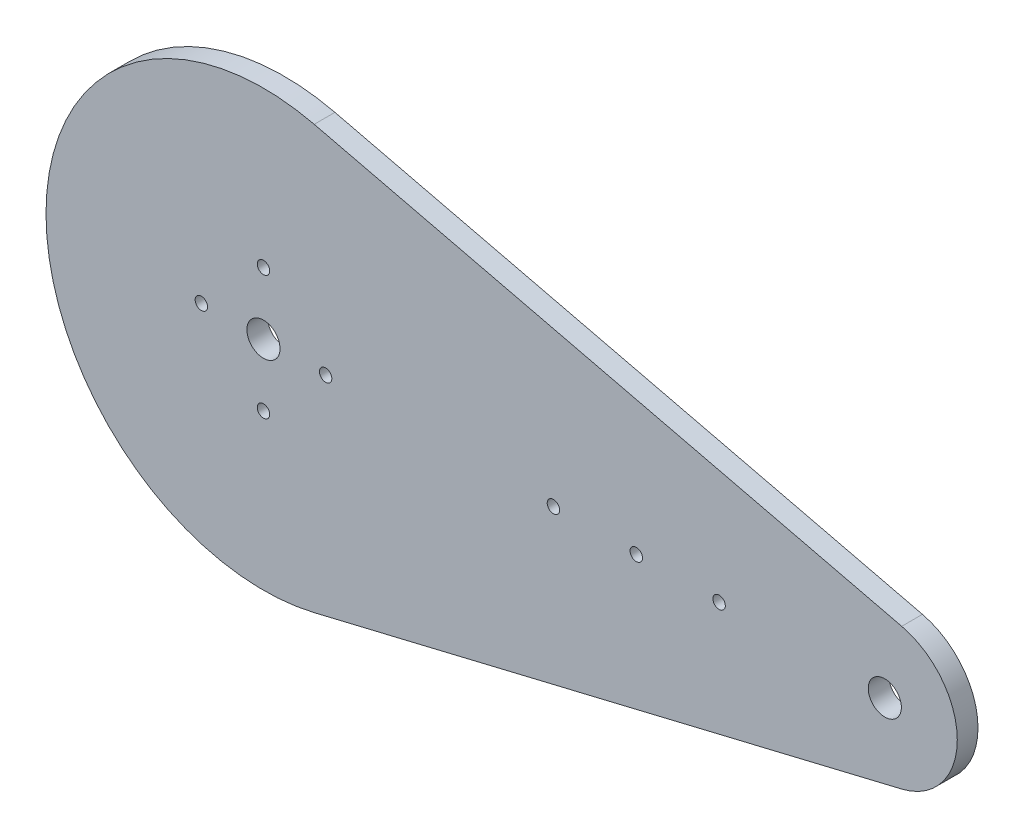
ISO-10303-21;
HEADER;
FILE_DESCRIPTION(('STEP AP214'),'2;1');
FILE_NAME('part.step','',(''),(''),'','','');
FILE_SCHEMA(('AUTOMOTIVE_DESIGN { 1 0 10303 214 1 1 1 1 }'));
ENDSEC;
DATA;
#1=APPLICATION_CONTEXT('core data for automotive mechanical design processes');
#2=APPLICATION_PROTOCOL_DEFINITION('international standard','automotive_design',2000,#1);
#3=PRODUCT_CONTEXT('',#1,'mechanical');
#4=PRODUCT('Part','Part','',(#3));
#5=PRODUCT_RELATED_PRODUCT_CATEGORY('part','',(#4));
#6=PRODUCT_DEFINITION_FORMATION('','',#4);
#7=PRODUCT_DEFINITION_CONTEXT('part definition',#1,'design');
#8=PRODUCT_DEFINITION('design','',#6,#7);
#9=PRODUCT_DEFINITION_SHAPE('','',#8);
#10=(LENGTH_UNIT() NAMED_UNIT(*) SI_UNIT(.MILLI.,.METRE.));
#11=(NAMED_UNIT(*) PLANE_ANGLE_UNIT() SI_UNIT($,.RADIAN.));
#12=(NAMED_UNIT(*) SI_UNIT($,.STERADIAN.) SOLID_ANGLE_UNIT());
#13=UNCERTAINTY_MEASURE_WITH_UNIT(LENGTH_MEASURE(1.E-05),#10,'distance_accuracy_value','');
#14=(GEOMETRIC_REPRESENTATION_CONTEXT(3) GLOBAL_UNCERTAINTY_ASSIGNED_CONTEXT((#13)) GLOBAL_UNIT_ASSIGNED_CONTEXT((#10,
#11,#12)) REPRESENTATION_CONTEXT('',''));
#15=CARTESIAN_POINT('',(0.,0.,0.));
#16=DIRECTION('',(0.,0.,1.));
#17=DIRECTION('',(1.,0.,0.));
#18=AXIS2_PLACEMENT_3D('',#15,#16,#17);
#19=CARTESIAN_POINT('',(0.,0.,5.));
#20=DIRECTION('',(0.,0.,1.));
#21=DIRECTION('',(1.,0.,0.));
#22=AXIS2_PLACEMENT_3D('',#19,#20,#21);
#23=PLANE('',#22);
#24=CARTESIAN_POINT('',(150.,0.,5.));
#25=DIRECTION('',(0.,0.,1.));
#26=DIRECTION('',(1.,0.,0.));
#27=AXIS2_PLACEMENT_3D('',#24,#25,#26);
#28=CIRCLE('',#27,3.99999999999999);
#29=CARTESIAN_POINT('',(154.,0.,5.));
#30=VERTEX_POINT('',#29);
#31=EDGE_CURVE('E124',#30,#30,#28,.T.);
#32=ORIENTED_EDGE('',*,*,#31,.F.);
#33=EDGE_LOOP('',(#32));
#34=FACE_BOUND('',#33,.T.);
#35=CARTESIAN_POINT('',(90.,0.,5.));
#36=DIRECTION('',(0.,0.,1.));
#37=DIRECTION('',(1.,0.,0.));
#38=AXIS2_PLACEMENT_3D('',#35,#36,#37);
#39=CIRCLE('',#38,1.5);
#40=CARTESIAN_POINT('',(91.5,0.,5.));
#41=VERTEX_POINT('',#40);
#42=EDGE_CURVE('E121',#41,#41,#39,.T.);
#43=ORIENTED_EDGE('',*,*,#42,.F.);
#44=EDGE_LOOP('',(#43));
#45=FACE_BOUND('',#44,.T.);
#46=CARTESIAN_POINT('',(110.,0.,5.));
#47=DIRECTION('',(0.,0.,1.));
#48=DIRECTION('',(1.,0.,0.));
#49=AXIS2_PLACEMENT_3D('',#46,#47,#48);
#50=CIRCLE('',#49,1.5);
#51=CARTESIAN_POINT('',(111.5,0.,5.));
#52=VERTEX_POINT('',#51);
#53=EDGE_CURVE('E115',#52,#52,#50,.T.);
#54=ORIENTED_EDGE('',*,*,#53,.F.);
#55=EDGE_LOOP('',(#54));
#56=FACE_BOUND('',#55,.T.);
#57=CARTESIAN_POINT('',(0.,0.,5.));
#58=DIRECTION('',(0.,0.,1.));
#59=DIRECTION('',(1.,0.,0.));
#60=AXIS2_PLACEMENT_3D('',#57,#58,#59);
#61=CIRCLE('',#60,52.5);
#62=CARTESIAN_POINT('',(12.25,51.0508325103519,5.));
#63=VERTEX_POINT('',#62);
#64=CARTESIAN_POINT('',(12.25,-51.0508325103519,5.));
#65=VERTEX_POINT('',#64);
#66=EDGE_CURVE('E104',#63,#65,#61,.T.);
#67=ORIENTED_EDGE('',*,*,#66,.T.);
#68=DIRECTION('',(0.972396809720988,0.233333333333333,0.));
#69=VECTOR('',#68,1.);
#70=CARTESIAN_POINT('',(12.25,-51.0508325103519,5.));
#71=LINE('',#70,#69);
#72=CARTESIAN_POINT('',(154.083333333333,-17.0169441701173,5.));
#73=VERTEX_POINT('',#72);
#74=EDGE_CURVE('E97',#65,#73,#71,.T.);
#75=ORIENTED_EDGE('',*,*,#74,.T.);
#76=CARTESIAN_POINT('',(150.,0.,5.));
#77=DIRECTION('',(0.,0.,1.));
#78=DIRECTION('',(1.,0.,0.));
#79=AXIS2_PLACEMENT_3D('',#76,#77,#78);
#80=CIRCLE('',#79,17.5);
#81=CARTESIAN_POINT('',(154.083333333333,17.0169441701173,5.));
#82=VERTEX_POINT('',#81);
#83=EDGE_CURVE('E103',#73,#82,#80,.T.);
#84=ORIENTED_EDGE('',*,*,#83,.T.);
#85=DIRECTION('',(0.972396809720988,-0.233333333333333,0.));
#86=VECTOR('',#85,1.);
#87=CARTESIAN_POINT('',(12.25,51.0508325103519,5.));
#88=LINE('',#87,#86);
#89=EDGE_CURVE('E113',#63,#82,#88,.T.);
#90=ORIENTED_EDGE('',*,*,#89,.F.);
#91=EDGE_LOOP('',(#67,#75,#84,#90));
#92=FACE_BOUND('',#91,.T.);
#93=CARTESIAN_POINT('',(0.,0.,5.));
#94=DIRECTION('',(0.,0.,1.));
#95=DIRECTION('',(1.,0.,0.));
#96=AXIS2_PLACEMENT_3D('',#93,#94,#95);
#97=CIRCLE('',#96,4.);
#98=CARTESIAN_POINT('',(4.,0.,5.));
#99=VERTEX_POINT('',#98);
#100=EDGE_CURVE('E181',#99,#99,#97,.T.);
#101=ORIENTED_EDGE('',*,*,#100,.F.);
#102=EDGE_LOOP('',(#101));
#103=FACE_BOUND('',#102,.T.);
#104=CARTESIAN_POINT('',(15.0000000000001,0.,5.));
#105=DIRECTION('',(0.,0.,1.));
#106=DIRECTION('',(1.,0.,0.));
#107=AXIS2_PLACEMENT_3D('',#104,#105,#106);
#108=CIRCLE('',#107,1.5);
#109=CARTESIAN_POINT('',(16.5000000000001,0.,5.));
#110=VERTEX_POINT('',#109);
#111=EDGE_CURVE('E178',#110,#110,#108,.T.);
#112=ORIENTED_EDGE('',*,*,#111,.F.);
#113=EDGE_LOOP('',(#112));
#114=FACE_BOUND('',#113,.T.);
#115=CARTESIAN_POINT('',(0.,15.,5.));
#116=DIRECTION('',(0.,0.,1.));
#117=DIRECTION('',(1.,0.,0.));
#118=AXIS2_PLACEMENT_3D('',#115,#116,#117);
#119=CIRCLE('',#118,1.5);
#120=CARTESIAN_POINT('',(1.5000000000001,15.,5.));
#121=VERTEX_POINT('',#120);
#122=EDGE_CURVE('E170',#121,#121,#119,.T.);
#123=ORIENTED_EDGE('',*,*,#122,.F.);
#124=EDGE_LOOP('',(#123));
#125=FACE_BOUND('',#124,.T.);
#126=CARTESIAN_POINT('',(-14.9999999999999,0.,5.));
#127=DIRECTION('',(0.,0.,1.));
#128=DIRECTION('',(1.,0.,0.));
#129=AXIS2_PLACEMENT_3D('',#126,#127,#128);
#130=CIRCLE('',#129,1.5);
#131=CARTESIAN_POINT('',(-13.4999999999999,0.,5.));
#132=VERTEX_POINT('',#131);
#133=EDGE_CURVE('E165',#132,#132,#130,.T.);
#134=ORIENTED_EDGE('',*,*,#133,.F.);
#135=EDGE_LOOP('',(#134));
#136=FACE_BOUND('',#135,.T.);
#137=CARTESIAN_POINT('',(0.,-15.,5.));
#138=DIRECTION('',(0.,0.,1.));
#139=DIRECTION('',(1.,0.,0.));
#140=AXIS2_PLACEMENT_3D('',#137,#138,#139);
#141=CIRCLE('',#140,1.5);
#142=CARTESIAN_POINT('',(1.5000000000001,-15.,5.));
#143=VERTEX_POINT('',#142);
#144=EDGE_CURVE('E160',#143,#143,#141,.T.);
#145=ORIENTED_EDGE('',*,*,#144,.F.);
#146=EDGE_LOOP('',(#145));
#147=FACE_BOUND('',#146,.T.);
#148=CARTESIAN_POINT('',(70.,0.,5.));
#149=DIRECTION('',(0.,0.,1.));
#150=DIRECTION('',(1.,0.,0.));
#151=AXIS2_PLACEMENT_3D('',#148,#149,#150);
#152=CIRCLE('',#151,1.5);
#153=CARTESIAN_POINT('',(71.5,0.,5.));
#154=VERTEX_POINT('',#153);
#155=EDGE_CURVE('E131',#154,#154,#152,.T.);
#156=ORIENTED_EDGE('',*,*,#155,.F.);
#157=EDGE_LOOP('',(#156));
#158=FACE_BOUND('',#157,.T.);
#159=ADVANCED_FACE('F54',(#34,#45,#56,#92,#103,#114,#125,#136,#147,#158),#23,.T.);
#160=CARTESIAN_POINT('',(0.,0.,0.));
#161=DIRECTION('',(0.,0.,1.));
#162=DIRECTION('',(1.,0.,0.));
#163=AXIS2_PLACEMENT_3D('',#160,#161,#162);
#164=PLANE('',#163);
#165=CARTESIAN_POINT('',(0.,-15.,0.));
#166=DIRECTION('',(0.,0.,1.));
#167=DIRECTION('',(1.,0.,0.));
#168=AXIS2_PLACEMENT_3D('',#165,#166,#167);
#169=CIRCLE('',#168,1.5);
#170=CARTESIAN_POINT('',(1.5000000000001,-15.,0.));
#171=VERTEX_POINT('',#170);
#172=EDGE_CURVE('E127',#171,#171,#169,.T.);
#173=ORIENTED_EDGE('',*,*,#172,.T.);
#174=EDGE_LOOP('',(#173));
#175=FACE_BOUND('',#174,.T.);
#176=CARTESIAN_POINT('',(-14.9999999999999,0.,0.));
#177=DIRECTION('',(0.,0.,1.));
#178=DIRECTION('',(1.,0.,0.));
#179=AXIS2_PLACEMENT_3D('',#176,#177,#178);
#180=CIRCLE('',#179,1.5);
#181=CARTESIAN_POINT('',(-13.4999999999999,0.,0.));
#182=VERTEX_POINT('',#181);
#183=EDGE_CURVE('E130',#182,#182,#180,.T.);
#184=ORIENTED_EDGE('',*,*,#183,.T.);
#185=EDGE_LOOP('',(#184));
#186=FACE_BOUND('',#185,.T.);
#187=CARTESIAN_POINT('',(0.,15.,0.));
#188=DIRECTION('',(0.,0.,1.));
#189=DIRECTION('',(1.,0.,0.));
#190=AXIS2_PLACEMENT_3D('',#187,#188,#189);
#191=CIRCLE('',#190,1.5);
#192=CARTESIAN_POINT('',(1.5000000000001,15.,0.));
#193=VERTEX_POINT('',#192);
#194=EDGE_CURVE('E134',#193,#193,#191,.T.);
#195=ORIENTED_EDGE('',*,*,#194,.T.);
#196=EDGE_LOOP('',(#195));
#197=FACE_BOUND('',#196,.T.);
#198=CARTESIAN_POINT('',(15.0000000000001,0.,0.));
#199=DIRECTION('',(0.,0.,1.));
#200=DIRECTION('',(1.,0.,0.));
#201=AXIS2_PLACEMENT_3D('',#198,#199,#200);
#202=CIRCLE('',#201,1.5);
#203=CARTESIAN_POINT('',(16.5000000000001,0.,0.));
#204=VERTEX_POINT('',#203);
#205=EDGE_CURVE('E137',#204,#204,#202,.T.);
#206=ORIENTED_EDGE('',*,*,#205,.T.);
#207=EDGE_LOOP('',(#206));
#208=FACE_BOUND('',#207,.T.);
#209=CARTESIAN_POINT('',(0.,0.,0.));
#210=DIRECTION('',(0.,0.,1.));
#211=DIRECTION('',(1.,0.,0.));
#212=AXIS2_PLACEMENT_3D('',#209,#210,#211);
#213=CIRCLE('',#212,4.);
#214=CARTESIAN_POINT('',(4.,0.,0.));
#215=VERTEX_POINT('',#214);
#216=EDGE_CURVE('E140',#215,#215,#213,.T.);
#217=ORIENTED_EDGE('',*,*,#216,.T.);
#218=EDGE_LOOP('',(#217));
#219=FACE_BOUND('',#218,.T.);
#220=CARTESIAN_POINT('',(0.,0.,0.));
#221=DIRECTION('',(0.,0.,1.));
#222=DIRECTION('',(1.,0.,0.));
#223=AXIS2_PLACEMENT_3D('',#220,#221,#222);
#224=CIRCLE('',#223,52.5);
#225=CARTESIAN_POINT('',(12.25,51.0508325103519,0.));
#226=VERTEX_POINT('',#225);
#227=CARTESIAN_POINT('',(12.25,-51.0508325103519,0.));
#228=VERTEX_POINT('',#227);
#229=EDGE_CURVE('E143',#226,#228,#224,.T.);
#230=ORIENTED_EDGE('',*,*,#229,.F.);
#231=DIRECTION('',(0.972396809720988,-0.233333333333333,0.));
#232=VECTOR('',#231,1.);
#233=CARTESIAN_POINT('',(12.25,51.0508325103519,0.));
#234=LINE('',#233,#232);
#235=CARTESIAN_POINT('',(154.083333333333,17.0169441701173,0.));
#236=VERTEX_POINT('',#235);
#237=EDGE_CURVE('E148',#226,#236,#234,.T.);
#238=ORIENTED_EDGE('',*,*,#237,.T.);
#239=CARTESIAN_POINT('',(150.,0.,0.));
#240=DIRECTION('',(0.,0.,1.));
#241=DIRECTION('',(1.,0.,0.));
#242=AXIS2_PLACEMENT_3D('',#239,#240,#241);
#243=CIRCLE('',#242,17.5);
#244=CARTESIAN_POINT('',(154.083333333333,-17.0169441701173,0.));
#245=VERTEX_POINT('',#244);
#246=EDGE_CURVE('E146',#245,#236,#243,.T.);
#247=ORIENTED_EDGE('',*,*,#246,.F.);
#248=DIRECTION('',(0.972396809720988,0.233333333333333,0.));
#249=VECTOR('',#248,1.);
#250=CARTESIAN_POINT('',(12.25,-51.0508325103519,0.));
#251=LINE('',#250,#249);
#252=EDGE_CURVE('E109',#228,#245,#251,.T.);
#253=ORIENTED_EDGE('',*,*,#252,.F.);
#254=EDGE_LOOP('',(#230,#238,#247,#253));
#255=FACE_BOUND('',#254,.T.);
#256=CARTESIAN_POINT('',(110.,0.,0.));
#257=DIRECTION('',(0.,0.,1.));
#258=DIRECTION('',(1.,0.,0.));
#259=AXIS2_PLACEMENT_3D('',#256,#257,#258);
#260=CIRCLE('',#259,1.5);
#261=CARTESIAN_POINT('',(111.5,0.,0.));
#262=VERTEX_POINT('',#261);
#263=EDGE_CURVE('E151',#262,#262,#260,.T.);
#264=ORIENTED_EDGE('',*,*,#263,.T.);
#265=EDGE_LOOP('',(#264));
#266=FACE_BOUND('',#265,.T.);
#267=CARTESIAN_POINT('',(90.,0.,0.));
#268=DIRECTION('',(0.,0.,1.));
#269=DIRECTION('',(1.,0.,0.));
#270=AXIS2_PLACEMENT_3D('',#267,#268,#269);
#271=CIRCLE('',#270,1.5);
#272=CARTESIAN_POINT('',(91.5,0.,0.));
#273=VERTEX_POINT('',#272);
#274=EDGE_CURVE('E154',#273,#273,#271,.T.);
#275=ORIENTED_EDGE('',*,*,#274,.T.);
#276=EDGE_LOOP('',(#275));
#277=FACE_BOUND('',#276,.T.);
#278=CARTESIAN_POINT('',(150.,0.,0.));
#279=DIRECTION('',(0.,0.,1.));
#280=DIRECTION('',(1.,0.,0.));
#281=AXIS2_PLACEMENT_3D('',#278,#279,#280);
#282=CIRCLE('',#281,3.99999999999999);
#283=CARTESIAN_POINT('',(154.,0.,0.));
#284=VERTEX_POINT('',#283);
#285=EDGE_CURVE('E157',#284,#284,#282,.T.);
#286=ORIENTED_EDGE('',*,*,#285,.T.);
#287=EDGE_LOOP('',(#286));
#288=FACE_BOUND('',#287,.T.);
#289=CARTESIAN_POINT('',(70.,0.,0.));
#290=DIRECTION('',(0.,0.,1.));
#291=DIRECTION('',(1.,0.,0.));
#292=AXIS2_PLACEMENT_3D('',#289,#290,#291);
#293=CIRCLE('',#292,1.5);
#294=CARTESIAN_POINT('',(71.5,0.,0.));
#295=VERTEX_POINT('',#294);
#296=EDGE_CURVE('E173',#295,#295,#293,.T.);
#297=ORIENTED_EDGE('',*,*,#296,.T.);
#298=EDGE_LOOP('',(#297));
#299=FACE_BOUND('',#298,.T.);
#300=ADVANCED_FACE('F189',(#175,#186,#197,#208,#219,#255,#266,#277,#288,#299),#164,.F.);
#301=CARTESIAN_POINT('',(0.,0.,5.));
#302=DIRECTION('',(0.,0.,-1.));
#303=DIRECTION('',(-1.,0.,0.));
#304=AXIS2_PLACEMENT_3D('',#301,#302,#303);
#305=CYLINDRICAL_SURFACE('',#304,52.5);
#306=ORIENTED_EDGE('',*,*,#229,.T.);
#307=DIRECTION('',(0.,0.,-1.));
#308=VECTOR('',#307,1.);
#309=CARTESIAN_POINT('',(12.25,-51.0508325103519,5.));
#310=LINE('',#309,#308);
#311=EDGE_CURVE('E12',#65,#228,#310,.T.);
#312=ORIENTED_EDGE('',*,*,#311,.F.);
#313=ORIENTED_EDGE('',*,*,#66,.F.);
#314=DIRECTION('',(0.,0.,-1.));
#315=VECTOR('',#314,1.);
#316=CARTESIAN_POINT('',(12.25,51.0508325103519,5.));
#317=LINE('',#316,#315);
#318=EDGE_CURVE('E71',#63,#226,#317,.T.);
#319=ORIENTED_EDGE('',*,*,#318,.T.);
#320=EDGE_LOOP('',(#306,#312,#313,#319));
#321=FACE_BOUND('',#320,.T.);
#322=ADVANCED_FACE('F217',(#321),#305,.T.);
#323=CARTESIAN_POINT('',(12.25,-51.0508325103519,5.));
#324=DIRECTION('',(-0.233333333333333,0.972396809720988,0.));
#325=DIRECTION('',(-0.972396809720988,-0.233333333333333,0.));
#326=AXIS2_PLACEMENT_3D('',#323,#324,#325);
#327=PLANE('',#326);
#328=ORIENTED_EDGE('',*,*,#252,.T.);
#329=DIRECTION('',(0.,0.,-1.));
#330=VECTOR('',#329,1.);
#331=CARTESIAN_POINT('',(154.083333333333,-17.0169441701173,5.));
#332=LINE('',#331,#330);
#333=EDGE_CURVE('E63',#73,#245,#332,.T.);
#334=ORIENTED_EDGE('',*,*,#333,.F.);
#335=ORIENTED_EDGE('',*,*,#74,.F.);
#336=ORIENTED_EDGE('',*,*,#311,.T.);
#337=EDGE_LOOP('',(#328,#334,#335,#336));
#338=FACE_BOUND('',#337,.T.);
#339=ADVANCED_FACE('F108',(#338),#327,.F.);
#340=CARTESIAN_POINT('',(150.,0.,5.));
#341=DIRECTION('',(0.,0.,-1.));
#342=DIRECTION('',(-1.,0.,0.));
#343=AXIS2_PLACEMENT_3D('',#340,#341,#342);
#344=CYLINDRICAL_SURFACE('',#343,17.5);
#345=ORIENTED_EDGE('',*,*,#246,.T.);
#346=DIRECTION('',(0.,0.,-1.));
#347=VECTOR('',#346,1.);
#348=CARTESIAN_POINT('',(154.083333333333,17.0169441701173,5.));
#349=LINE('',#348,#347);
#350=EDGE_CURVE('E86',#82,#236,#349,.T.);
#351=ORIENTED_EDGE('',*,*,#350,.F.);
#352=ORIENTED_EDGE('',*,*,#83,.F.);
#353=ORIENTED_EDGE('',*,*,#333,.T.);
#354=EDGE_LOOP('',(#345,#351,#352,#353));
#355=FACE_BOUND('',#354,.T.);
#356=ADVANCED_FACE('F112',(#355),#344,.T.);
#357=CARTESIAN_POINT('',(90.,0.,5.));
#358=DIRECTION('',(0.,0.,-1.));
#359=DIRECTION('',(-1.,0.,0.));
#360=AXIS2_PLACEMENT_3D('',#357,#358,#359);
#361=CYLINDRICAL_SURFACE('',#360,1.5);
#362=ORIENTED_EDGE('',*,*,#42,.T.);
#363=EDGE_LOOP('',(#362));
#364=FACE_BOUND('',#363,.T.);
#365=ORIENTED_EDGE('',*,*,#274,.F.);
#366=EDGE_LOOP('',(#365));
#367=FACE_BOUND('',#366,.T.);
#368=ADVANCED_FACE('F220',(#364,#367),#361,.F.);
#369=CARTESIAN_POINT('',(110.,0.,5.));
#370=DIRECTION('',(0.,0.,-1.));
#371=DIRECTION('',(-1.,0.,0.));
#372=AXIS2_PLACEMENT_3D('',#369,#370,#371);
#373=CYLINDRICAL_SURFACE('',#372,1.5);
#374=ORIENTED_EDGE('',*,*,#53,.T.);
#375=EDGE_LOOP('',(#374));
#376=FACE_BOUND('',#375,.T.);
#377=ORIENTED_EDGE('',*,*,#263,.F.);
#378=EDGE_LOOP('',(#377));
#379=FACE_BOUND('',#378,.T.);
#380=ADVANCED_FACE('F223',(#376,#379),#373,.F.);
#381=CARTESIAN_POINT('',(12.25,51.0508325103519,5.));
#382=DIRECTION('',(0.233333333333333,0.972396809720988,0.));
#383=DIRECTION('',(-0.972396809720988,0.233333333333333,0.));
#384=AXIS2_PLACEMENT_3D('',#381,#382,#383);
#385=PLANE('',#384);
#386=ORIENTED_EDGE('',*,*,#237,.F.);
#387=ORIENTED_EDGE('',*,*,#318,.F.);
#388=ORIENTED_EDGE('',*,*,#89,.T.);
#389=ORIENTED_EDGE('',*,*,#350,.T.);
#390=EDGE_LOOP('',(#386,#387,#388,#389));
#391=FACE_BOUND('',#390,.T.);
#392=ADVANCED_FACE('F227',(#391),#385,.T.);
#393=CARTESIAN_POINT('',(0.,0.,5.));
#394=DIRECTION('',(0.,0.,-1.));
#395=DIRECTION('',(-1.,0.,0.));
#396=AXIS2_PLACEMENT_3D('',#393,#394,#395);
#397=CYLINDRICAL_SURFACE('',#396,4.);
#398=ORIENTED_EDGE('',*,*,#100,.T.);
#399=EDGE_LOOP('',(#398));
#400=FACE_BOUND('',#399,.T.);
#401=ORIENTED_EDGE('',*,*,#216,.F.);
#402=EDGE_LOOP('',(#401));
#403=FACE_BOUND('',#402,.T.);
#404=ADVANCED_FACE('F185',(#400,#403),#397,.F.);
#405=CARTESIAN_POINT('',(15.0000000000001,0.,5.));
#406=DIRECTION('',(0.,0.,-1.));
#407=DIRECTION('',(-1.,0.,0.));
#408=AXIS2_PLACEMENT_3D('',#405,#406,#407);
#409=CYLINDRICAL_SURFACE('',#408,1.5);
#410=ORIENTED_EDGE('',*,*,#111,.T.);
#411=EDGE_LOOP('',(#410));
#412=FACE_BOUND('',#411,.T.);
#413=ORIENTED_EDGE('',*,*,#205,.F.);
#414=EDGE_LOOP('',(#413));
#415=FACE_BOUND('',#414,.T.);
#416=ADVANCED_FACE('F239',(#412,#415),#409,.F.);
#417=CARTESIAN_POINT('',(0.,15.,5.));
#418=DIRECTION('',(0.,0.,-1.));
#419=DIRECTION('',(-1.,0.,0.));
#420=AXIS2_PLACEMENT_3D('',#417,#418,#419);
#421=CYLINDRICAL_SURFACE('',#420,1.5);
#422=ORIENTED_EDGE('',*,*,#122,.T.);
#423=EDGE_LOOP('',(#422));
#424=FACE_BOUND('',#423,.T.);
#425=ORIENTED_EDGE('',*,*,#194,.F.);
#426=EDGE_LOOP('',(#425));
#427=FACE_BOUND('',#426,.T.);
#428=ADVANCED_FACE('F242',(#424,#427),#421,.F.);
#429=CARTESIAN_POINT('',(-14.9999999999999,0.,5.));
#430=DIRECTION('',(0.,0.,-1.));
#431=DIRECTION('',(-1.,0.,0.));
#432=AXIS2_PLACEMENT_3D('',#429,#430,#431);
#433=CYLINDRICAL_SURFACE('',#432,1.5);
#434=ORIENTED_EDGE('',*,*,#133,.T.);
#435=EDGE_LOOP('',(#434));
#436=FACE_BOUND('',#435,.T.);
#437=ORIENTED_EDGE('',*,*,#183,.F.);
#438=EDGE_LOOP('',(#437));
#439=FACE_BOUND('',#438,.T.);
#440=ADVANCED_FACE('F245',(#436,#439),#433,.F.);
#441=CARTESIAN_POINT('',(0.,-15.,5.));
#442=DIRECTION('',(0.,0.,-1.));
#443=DIRECTION('',(-1.,0.,0.));
#444=AXIS2_PLACEMENT_3D('',#441,#442,#443);
#445=CYLINDRICAL_SURFACE('',#444,1.5);
#446=ORIENTED_EDGE('',*,*,#144,.T.);
#447=EDGE_LOOP('',(#446));
#448=FACE_BOUND('',#447,.T.);
#449=ORIENTED_EDGE('',*,*,#172,.F.);
#450=EDGE_LOOP('',(#449));
#451=FACE_BOUND('',#450,.T.);
#452=ADVANCED_FACE('F56',(#448,#451),#445,.F.);
#453=CARTESIAN_POINT('',(150.,0.,5.));
#454=DIRECTION('',(0.,0.,-1.));
#455=DIRECTION('',(-1.,0.,0.));
#456=AXIS2_PLACEMENT_3D('',#453,#454,#455);
#457=CYLINDRICAL_SURFACE('',#456,3.99999999999999);
#458=ORIENTED_EDGE('',*,*,#31,.T.);
#459=EDGE_LOOP('',(#458));
#460=FACE_BOUND('',#459,.T.);
#461=ORIENTED_EDGE('',*,*,#285,.F.);
#462=EDGE_LOOP('',(#461));
#463=FACE_BOUND('',#462,.T.);
#464=ADVANCED_FACE('F208',(#460,#463),#457,.F.);
#465=CARTESIAN_POINT('',(70.,0.,5.));
#466=DIRECTION('',(0.,0.,-1.));
#467=DIRECTION('',(-1.,0.,0.));
#468=AXIS2_PLACEMENT_3D('',#465,#466,#467);
#469=CYLINDRICAL_SURFACE('',#468,1.5);
#470=ORIENTED_EDGE('',*,*,#155,.T.);
#471=EDGE_LOOP('',(#470));
#472=FACE_BOUND('',#471,.T.);
#473=ORIENTED_EDGE('',*,*,#296,.F.);
#474=EDGE_LOOP('',(#473));
#475=FACE_BOUND('',#474,.T.);
#476=ADVANCED_FACE('F206',(#472,#475),#469,.F.);
#477=CLOSED_SHELL('',(#159,#300,#322,#339,#356,#368,#380,#392,#404,#416,#428,#440,#452,#464,#476));
#478=MANIFOLD_SOLID_BREP('B2',#477);
#479=ADVANCED_BREP_SHAPE_REPRESENTATION('',(#18,#478),#14);
#480=SHAPE_DEFINITION_REPRESENTATION(#9,#479);
ENDSEC;
END-ISO-10303-21;
